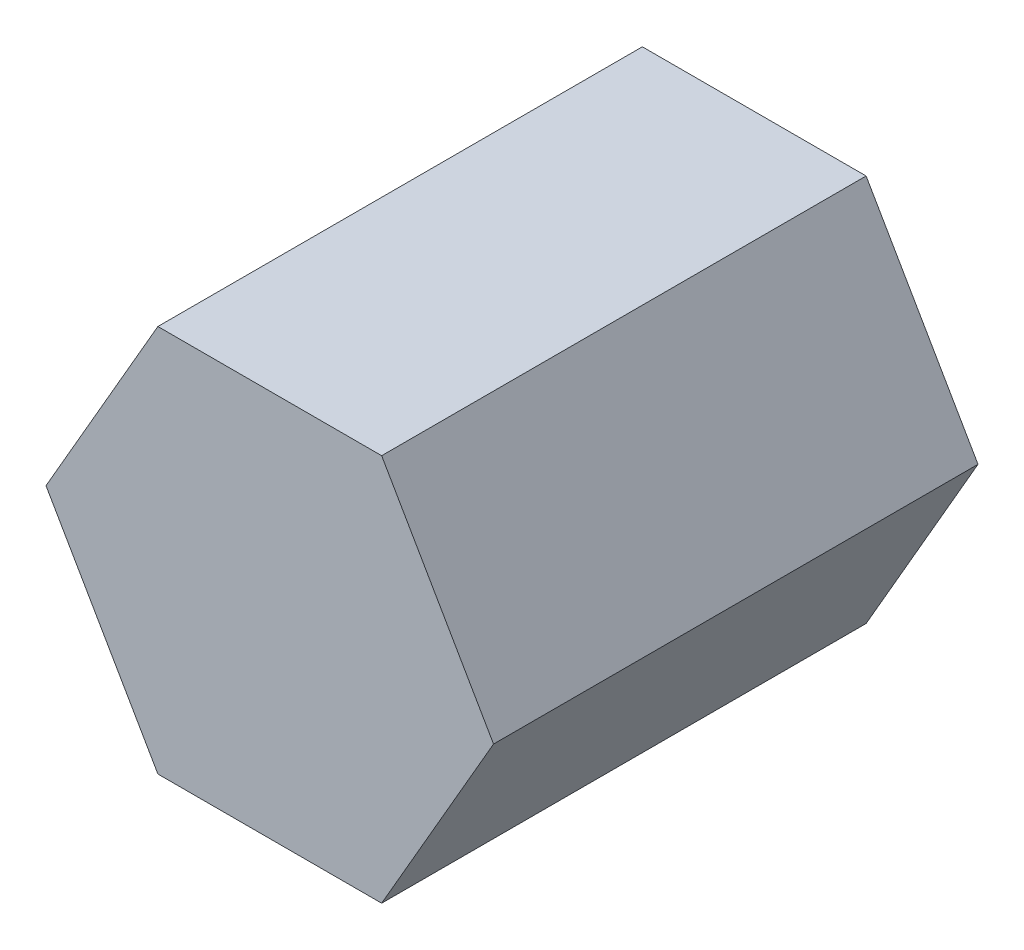
ISO-10303-21;
HEADER;
FILE_DESCRIPTION(('STEP AP214'),'2;1');
FILE_NAME('part.step','',(''),(''),'','','');
FILE_SCHEMA(('AUTOMOTIVE_DESIGN { 1 0 10303 214 1 1 1 1 }'));
ENDSEC;
DATA;
#1=APPLICATION_CONTEXT('core data for automotive mechanical design processes');
#2=APPLICATION_PROTOCOL_DEFINITION('international standard','automotive_design',2000,#1);
#3=PRODUCT_CONTEXT('',#1,'mechanical');
#4=PRODUCT('Part','Part','',(#3));
#5=PRODUCT_RELATED_PRODUCT_CATEGORY('part','',(#4));
#6=PRODUCT_DEFINITION_FORMATION('','',#4);
#7=PRODUCT_DEFINITION_CONTEXT('part definition',#1,'design');
#8=PRODUCT_DEFINITION('design','',#6,#7);
#9=PRODUCT_DEFINITION_SHAPE('','',#8);
#10=(LENGTH_UNIT() NAMED_UNIT(*) SI_UNIT(.MILLI.,.METRE.));
#11=(NAMED_UNIT(*) PLANE_ANGLE_UNIT() SI_UNIT($,.RADIAN.));
#12=(NAMED_UNIT(*) SI_UNIT($,.STERADIAN.) SOLID_ANGLE_UNIT());
#13=UNCERTAINTY_MEASURE_WITH_UNIT(LENGTH_MEASURE(1.E-05),#10,'distance_accuracy_value','');
#14=(GEOMETRIC_REPRESENTATION_CONTEXT(3) GLOBAL_UNCERTAINTY_ASSIGNED_CONTEXT((#13)) GLOBAL_UNIT_ASSIGNED_CONTEXT((#10,
#11,#12)) REPRESENTATION_CONTEXT('',''));
#15=CARTESIAN_POINT('',(0.,0.,0.));
#16=DIRECTION('',(0.,0.,1.));
#17=DIRECTION('',(1.,0.,0.));
#18=AXIS2_PLACEMENT_3D('',#15,#16,#17);
#19=CARTESIAN_POINT('',(0.,0.,0.));
#20=DIRECTION('',(0.,0.,1.));
#21=DIRECTION('',(1.,0.,0.));
#22=AXIS2_PLACEMENT_3D('',#19,#20,#21);
#23=PLANE('',#22);
#24=DIRECTION('',(0.499999999999995,0.866025403784442,0.));
#25=VECTOR('',#24,1.);
#26=CARTESIAN_POINT('',(2.30940107675854,-3.99999999999996,0.));
#27=LINE('',#26,#25);
#28=CARTESIAN_POINT('',(2.30940107675854,-3.99999999999996,0.));
#29=VERTEX_POINT('',#28);
#30=CARTESIAN_POINT('',(4.61880215351699,0.,0.));
#31=VERTEX_POINT('',#30);
#32=EDGE_CURVE('E130',#29,#31,#27,.T.);
#33=ORIENTED_EDGE('',*,*,#32,.F.);
#34=DIRECTION('',(1.,0.,0.));
#35=VECTOR('',#34,1.);
#36=CARTESIAN_POINT('',(-2.30940107675846,-4.00000000000001,0.));
#37=LINE('',#36,#35);
#38=CARTESIAN_POINT('',(-2.30940107675846,-4.00000000000001,0.));
#39=VERTEX_POINT('',#38);
#40=EDGE_CURVE('E84',#39,#29,#37,.T.);
#41=ORIENTED_EDGE('',*,*,#40,.F.);
#42=DIRECTION('',(0.500000000000007,-0.866025403784435,0.));
#43=VECTOR('',#42,1.);
#44=CARTESIAN_POINT('',(-4.61880215351699,0.,0.));
#45=LINE('',#44,#43);
#46=CARTESIAN_POINT('',(-4.61880215351699,0.,0.));
#47=VERTEX_POINT('',#46);
#48=EDGE_CURVE('E139',#47,#39,#45,.T.);
#49=ORIENTED_EDGE('',*,*,#48,.F.);
#50=DIRECTION('',(-0.499999999999995,-0.866025403784442,0.));
#51=VECTOR('',#50,1.);
#52=CARTESIAN_POINT('',(-2.30940107675851,3.99999999999998,0.));
#53=LINE('',#52,#51);
#54=CARTESIAN_POINT('',(-2.30940107675851,3.99999999999998,0.));
#55=VERTEX_POINT('',#54);
#56=EDGE_CURVE('E118',#55,#47,#53,.T.);
#57=ORIENTED_EDGE('',*,*,#56,.F.);
#58=DIRECTION('',(-1.,0.,0.));
#59=VECTOR('',#58,1.);
#60=CARTESIAN_POINT('',(2.30940107675849,3.99999999999999,0.));
#61=LINE('',#60,#59);
#62=CARTESIAN_POINT('',(2.30940107675849,3.99999999999999,0.));
#63=VERTEX_POINT('',#62);
#64=EDGE_CURVE('E136',#63,#55,#61,.T.);
#65=ORIENTED_EDGE('',*,*,#64,.F.);
#66=DIRECTION('',(-0.500000000000001,0.866025403784438,0.));
#67=VECTOR('',#66,1.);
#68=CARTESIAN_POINT('',(4.61880215351699,0.,0.));
#69=LINE('',#68,#67);
#70=EDGE_CURVE('E133',#31,#63,#69,.T.);
#71=ORIENTED_EDGE('',*,*,#70,.F.);
#72=EDGE_LOOP('',(#33,#41,#49,#57,#65,#71));
#73=FACE_BOUND('',#72,.T.);
#74=DIRECTION('',(-1.,0.,0.));
#75=VECTOR('',#74,1.);
#76=CARTESIAN_POINT('',(1.11,1.04571745705998,0.));
#77=LINE('',#76,#75);
#78=CARTESIAN_POINT('',(1.11,1.04571745705998,0.));
#79=VERTEX_POINT('',#78);
#80=CARTESIAN_POINT('',(-1.11,1.04571745705998,0.));
#81=VERTEX_POINT('',#80);
#82=EDGE_CURVE('E48',#79,#81,#77,.T.);
#83=ORIENTED_EDGE('',*,*,#82,.T.);
#84=CARTESIAN_POINT('',(0.,0.,0.));
#85=DIRECTION('',(0.,0.,-1.));
#86=DIRECTION('',(-1.,0.,0.));
#87=AXIS2_PLACEMENT_3D('',#84,#85,#86);
#88=CIRCLE('',#87,1.525);
#89=EDGE_CURVE('E163',#79,#81,#88,.T.);
#90=ORIENTED_EDGE('',*,*,#89,.F.);
#91=EDGE_LOOP('',(#83,#90));
#92=FACE_BOUND('',#91,.T.);
#93=ADVANCED_FACE('F33',(#73,#92),#23,.F.);
#94=CARTESIAN_POINT('',(2.30940107675854,-3.99999999999996,10.));
#95=DIRECTION('',(-0.866025403784442,0.499999999999995,0.));
#96=DIRECTION('',(-0.499999999999995,-0.866025403784442,0.));
#97=AXIS2_PLACEMENT_3D('',#94,#95,#96);
#98=PLANE('',#97);
#99=ORIENTED_EDGE('',*,*,#32,.T.);
#100=DIRECTION('',(0.,0.,-1.));
#101=VECTOR('',#100,1.);
#102=CARTESIAN_POINT('',(4.61880215351699,0.,10.));
#103=LINE('',#102,#101);
#104=CARTESIAN_POINT('',(4.61880215351699,0.,10.));
#105=VERTEX_POINT('',#104);
#106=EDGE_CURVE('E11',#105,#31,#103,.T.);
#107=ORIENTED_EDGE('',*,*,#106,.F.);
#108=DIRECTION('',(0.499999999999995,0.866025403784442,0.));
#109=VECTOR('',#108,1.);
#110=CARTESIAN_POINT('',(2.30940107675854,-3.99999999999996,10.));
#111=LINE('',#110,#109);
#112=CARTESIAN_POINT('',(2.30940107675854,-3.99999999999996,10.));
#113=VERTEX_POINT('',#112);
#114=EDGE_CURVE('E142',#113,#105,#111,.T.);
#115=ORIENTED_EDGE('',*,*,#114,.F.);
#116=DIRECTION('',(0.,0.,-1.));
#117=VECTOR('',#116,1.);
#118=CARTESIAN_POINT('',(2.30940107675854,-3.99999999999996,10.));
#119=LINE('',#118,#117);
#120=EDGE_CURVE('E126',#113,#29,#119,.T.);
#121=ORIENTED_EDGE('',*,*,#120,.T.);
#122=EDGE_LOOP('',(#99,#107,#115,#121));
#123=FACE_BOUND('',#122,.T.);
#124=ADVANCED_FACE('F35',(#123),#98,.F.);
#125=CARTESIAN_POINT('',(4.61880215351699,0.,10.));
#126=DIRECTION('',(-0.866025403784438,-0.500000000000001,0.));
#127=DIRECTION('',(0.500000000000001,-0.866025403784438,0.));
#128=AXIS2_PLACEMENT_3D('',#125,#126,#127);
#129=PLANE('',#128);
#130=ORIENTED_EDGE('',*,*,#70,.T.);
#131=DIRECTION('',(0.,0.,-1.));
#132=VECTOR('',#131,1.);
#133=CARTESIAN_POINT('',(2.30940107675849,3.99999999999999,10.));
#134=LINE('',#133,#132);
#135=CARTESIAN_POINT('',(2.30940107675849,3.99999999999999,10.));
#136=VERTEX_POINT('',#135);
#137=EDGE_CURVE('E41',#136,#63,#134,.T.);
#138=ORIENTED_EDGE('',*,*,#137,.F.);
#139=DIRECTION('',(-0.500000000000001,0.866025403784438,0.));
#140=VECTOR('',#139,1.);
#141=CARTESIAN_POINT('',(4.61880215351699,0.,10.));
#142=LINE('',#141,#140);
#143=EDGE_CURVE('E92',#105,#136,#142,.T.);
#144=ORIENTED_EDGE('',*,*,#143,.F.);
#145=ORIENTED_EDGE('',*,*,#106,.T.);
#146=EDGE_LOOP('',(#130,#138,#144,#145));
#147=FACE_BOUND('',#146,.T.);
#148=ADVANCED_FACE('F193',(#147),#129,.F.);
#149=CARTESIAN_POINT('',(2.30940107675849,3.99999999999999,10.));
#150=DIRECTION('',(0.,-1.,0.));
#151=DIRECTION('',(1.,0.,0.));
#152=AXIS2_PLACEMENT_3D('',#149,#150,#151);
#153=PLANE('',#152);
#154=ORIENTED_EDGE('',*,*,#64,.T.);
#155=DIRECTION('',(0.,0.,-1.));
#156=VECTOR('',#155,1.);
#157=CARTESIAN_POINT('',(-2.30940107675851,3.99999999999998,10.));
#158=LINE('',#157,#156);
#159=CARTESIAN_POINT('',(-2.30940107675851,3.99999999999998,10.));
#160=VERTEX_POINT('',#159);
#161=EDGE_CURVE('E121',#160,#55,#158,.T.);
#162=ORIENTED_EDGE('',*,*,#161,.F.);
#163=DIRECTION('',(-1.,0.,0.));
#164=VECTOR('',#163,1.);
#165=CARTESIAN_POINT('',(2.30940107675849,3.99999999999999,10.));
#166=LINE('',#165,#164);
#167=EDGE_CURVE('E109',#136,#160,#166,.T.);
#168=ORIENTED_EDGE('',*,*,#167,.F.);
#169=ORIENTED_EDGE('',*,*,#137,.T.);
#170=EDGE_LOOP('',(#154,#162,#168,#169));
#171=FACE_BOUND('',#170,.T.);
#172=ADVANCED_FACE('F148',(#171),#153,.F.);
#173=CARTESIAN_POINT('',(-2.30940107675851,3.99999999999998,10.));
#174=DIRECTION('',(0.866025403784442,-0.499999999999995,0.));
#175=DIRECTION('',(0.499999999999995,0.866025403784442,0.));
#176=AXIS2_PLACEMENT_3D('',#173,#174,#175);
#177=PLANE('',#176);
#178=ORIENTED_EDGE('',*,*,#56,.T.);
#179=DIRECTION('',(0.,0.,-1.));
#180=VECTOR('',#179,1.);
#181=CARTESIAN_POINT('',(-4.61880215351699,0.,10.));
#182=LINE('',#181,#180);
#183=CARTESIAN_POINT('',(-4.61880215351699,0.,10.));
#184=VERTEX_POINT('',#183);
#185=EDGE_CURVE('E115',#184,#47,#182,.T.);
#186=ORIENTED_EDGE('',*,*,#185,.F.);
#187=DIRECTION('',(-0.499999999999995,-0.866025403784442,0.));
#188=VECTOR('',#187,1.);
#189=CARTESIAN_POINT('',(-2.30940107675851,3.99999999999998,10.));
#190=LINE('',#189,#188);
#191=EDGE_CURVE('E102',#160,#184,#190,.T.);
#192=ORIENTED_EDGE('',*,*,#191,.F.);
#193=ORIENTED_EDGE('',*,*,#161,.T.);
#194=EDGE_LOOP('',(#178,#186,#192,#193));
#195=FACE_BOUND('',#194,.T.);
#196=ADVANCED_FACE('F116',(#195),#177,.F.);
#197=CARTESIAN_POINT('',(-4.61880215351699,0.,10.));
#198=DIRECTION('',(0.866025403784435,0.500000000000007,0.));
#199=DIRECTION('',(-0.500000000000007,0.866025403784435,0.));
#200=AXIS2_PLACEMENT_3D('',#197,#198,#199);
#201=PLANE('',#200);
#202=ORIENTED_EDGE('',*,*,#48,.T.);
#203=DIRECTION('',(0.,0.,-1.));
#204=VECTOR('',#203,1.);
#205=CARTESIAN_POINT('',(-2.30940107675846,-4.00000000000001,10.));
#206=LINE('',#205,#204);
#207=CARTESIAN_POINT('',(-2.30940107675846,-4.00000000000001,10.));
#208=VERTEX_POINT('',#207);
#209=EDGE_CURVE('E122',#208,#39,#206,.T.);
#210=ORIENTED_EDGE('',*,*,#209,.F.);
#211=DIRECTION('',(0.500000000000007,-0.866025403784435,0.));
#212=VECTOR('',#211,1.);
#213=CARTESIAN_POINT('',(-4.61880215351699,0.,10.));
#214=LINE('',#213,#212);
#215=EDGE_CURVE('E106',#184,#208,#214,.T.);
#216=ORIENTED_EDGE('',*,*,#215,.F.);
#217=ORIENTED_EDGE('',*,*,#185,.T.);
#218=EDGE_LOOP('',(#202,#210,#216,#217));
#219=FACE_BOUND('',#218,.T.);
#220=ADVANCED_FACE('F124',(#219),#201,.F.);
#221=CARTESIAN_POINT('',(-2.30940107675846,-4.00000000000001,10.));
#222=DIRECTION('',(0.,1.,0.));
#223=DIRECTION('',(-1.,0.,0.));
#224=AXIS2_PLACEMENT_3D('',#221,#222,#223);
#225=PLANE('',#224);
#226=ORIENTED_EDGE('',*,*,#40,.T.);
#227=ORIENTED_EDGE('',*,*,#120,.F.);
#228=DIRECTION('',(1.,0.,0.));
#229=VECTOR('',#228,1.);
#230=CARTESIAN_POINT('',(-2.30940107675846,-4.00000000000001,10.));
#231=LINE('',#230,#229);
#232=EDGE_CURVE('E57',#208,#113,#231,.T.);
#233=ORIENTED_EDGE('',*,*,#232,.F.);
#234=ORIENTED_EDGE('',*,*,#209,.T.);
#235=EDGE_LOOP('',(#226,#227,#233,#234));
#236=FACE_BOUND('',#235,.T.);
#237=ADVANCED_FACE('F152',(#236),#225,.F.);
#238=CARTESIAN_POINT('',(0.,0.,10.));
#239=DIRECTION('',(0.,0.,1.));
#240=DIRECTION('',(1.,0.,0.));
#241=AXIS2_PLACEMENT_3D('',#238,#239,#240);
#242=PLANE('',#241);
#243=ORIENTED_EDGE('',*,*,#114,.T.);
#244=ORIENTED_EDGE('',*,*,#143,.T.);
#245=ORIENTED_EDGE('',*,*,#167,.T.);
#246=ORIENTED_EDGE('',*,*,#191,.T.);
#247=ORIENTED_EDGE('',*,*,#215,.T.);
#248=ORIENTED_EDGE('',*,*,#232,.T.);
#249=EDGE_LOOP('',(#243,#244,#245,#246,#247,#248));
#250=FACE_BOUND('',#249,.T.);
#251=ADVANCED_FACE('F104',(#250),#242,.T.);
#252=CARTESIAN_POINT('',(1.11,1.04571745705998,9.));
#253=DIRECTION('',(0.,-1.,0.));
#254=DIRECTION('',(0.,0.,-1.));
#255=AXIS2_PLACEMENT_3D('',#252,#253,#254);
#256=PLANE('',#255);
#257=ORIENTED_EDGE('',*,*,#82,.F.);
#258=DIRECTION('',(0.,0.,-1.));
#259=VECTOR('',#258,1.);
#260=CARTESIAN_POINT('',(1.11,1.04571745705998,9.));
#261=LINE('',#260,#259);
#262=CARTESIAN_POINT('',(1.11,1.04571745705998,9.));
#263=VERTEX_POINT('',#262);
#264=EDGE_CURVE('E160',#263,#79,#261,.T.);
#265=ORIENTED_EDGE('',*,*,#264,.F.);
#266=DIRECTION('',(-1.,0.,0.));
#267=VECTOR('',#266,1.);
#268=CARTESIAN_POINT('',(1.11,1.04571745705998,9.));
#269=LINE('',#268,#267);
#270=CARTESIAN_POINT('',(-1.11,1.04571745705998,9.));
#271=VERTEX_POINT('',#270);
#272=EDGE_CURVE('E166',#263,#271,#269,.T.);
#273=ORIENTED_EDGE('',*,*,#272,.T.);
#274=DIRECTION('',(0.,0.,-1.));
#275=VECTOR('',#274,1.);
#276=CARTESIAN_POINT('',(-1.11,1.04571745705998,9.));
#277=LINE('',#276,#275);
#278=EDGE_CURVE('E134',#271,#81,#277,.T.);
#279=ORIENTED_EDGE('',*,*,#278,.T.);
#280=EDGE_LOOP('',(#257,#265,#273,#279));
#281=FACE_BOUND('',#280,.T.);
#282=ADVANCED_FACE('F174',(#281),#256,.T.);
#283=CARTESIAN_POINT('',(0.,0.,9.));
#284=DIRECTION('',(0.,0.,-1.));
#285=DIRECTION('',(-1.,0.,0.));
#286=AXIS2_PLACEMENT_3D('',#283,#284,#285);
#287=CYLINDRICAL_SURFACE('',#286,1.525);
#288=ORIENTED_EDGE('',*,*,#89,.T.);
#289=ORIENTED_EDGE('',*,*,#278,.F.);
#290=CARTESIAN_POINT('',(0.,0.,9.));
#291=DIRECTION('',(0.,0.,-1.));
#292=DIRECTION('',(-1.,0.,0.));
#293=AXIS2_PLACEMENT_3D('',#290,#291,#292);
#294=CIRCLE('',#293,1.525);
#295=EDGE_CURVE('E162',#263,#271,#294,.T.);
#296=ORIENTED_EDGE('',*,*,#295,.F.);
#297=ORIENTED_EDGE('',*,*,#264,.T.);
#298=EDGE_LOOP('',(#288,#289,#296,#297));
#299=FACE_BOUND('',#298,.T.);
#300=ADVANCED_FACE('F179',(#299),#287,.F.);
#301=CARTESIAN_POINT('',(0.,0.,9.));
#302=DIRECTION('',(0.,0.,-1.));
#303=DIRECTION('',(-1.,0.,0.));
#304=AXIS2_PLACEMENT_3D('',#301,#302,#303);
#305=PLANE('',#304);
#306=ORIENTED_EDGE('',*,*,#272,.F.);
#307=ORIENTED_EDGE('',*,*,#295,.T.);
#308=EDGE_LOOP('',(#306,#307));
#309=FACE_BOUND('',#308,.T.);
#310=ADVANCED_FACE('F181',(#309),#305,.T.);
#311=CLOSED_SHELL('',(#93,#124,#148,#172,#196,#220,#237,#251,#282,#300,#310));
#312=MANIFOLD_SOLID_BREP('B2',#311);
#313=ADVANCED_BREP_SHAPE_REPRESENTATION('',(#18,#312),#14);
#314=SHAPE_DEFINITION_REPRESENTATION(#9,#313);
ENDSEC;
END-ISO-10303-21;
